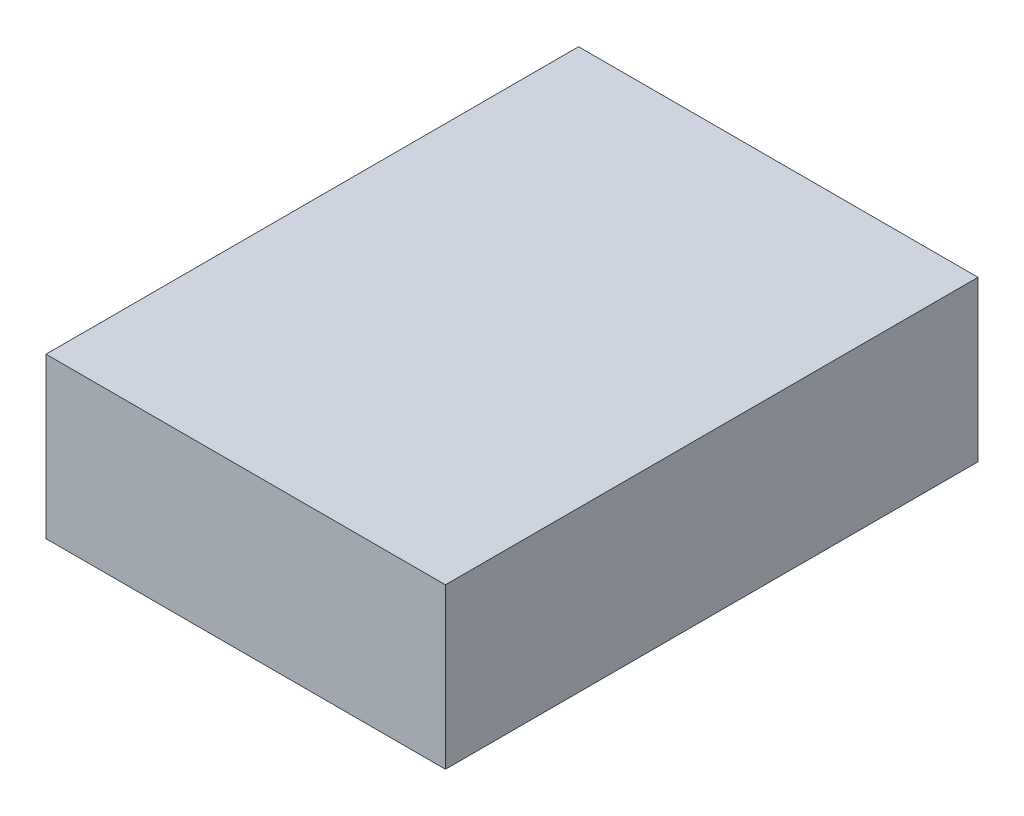
ISO-10303-21;
HEADER;
FILE_DESCRIPTION(('STEP AP214'),'2;1');
FILE_NAME('part.step','',(''),(''),'','','');
FILE_SCHEMA(('AUTOMOTIVE_DESIGN { 1 0 10303 214 1 1 1 1 }'));
ENDSEC;
DATA;
#1=APPLICATION_CONTEXT('core data for automotive mechanical design processes');
#2=APPLICATION_PROTOCOL_DEFINITION('international standard','automotive_design',2000,#1);
#3=PRODUCT_CONTEXT('',#1,'mechanical');
#4=PRODUCT('Part','Part','',(#3));
#5=PRODUCT_RELATED_PRODUCT_CATEGORY('part','',(#4));
#6=PRODUCT_DEFINITION_FORMATION('','',#4);
#7=PRODUCT_DEFINITION_CONTEXT('part definition',#1,'design');
#8=PRODUCT_DEFINITION('design','',#6,#7);
#9=PRODUCT_DEFINITION_SHAPE('','',#8);
#10=(LENGTH_UNIT() NAMED_UNIT(*) SI_UNIT(.MILLI.,.METRE.));
#11=(NAMED_UNIT(*) PLANE_ANGLE_UNIT() SI_UNIT($,.RADIAN.));
#12=(NAMED_UNIT(*) SI_UNIT($,.STERADIAN.) SOLID_ANGLE_UNIT());
#13=UNCERTAINTY_MEASURE_WITH_UNIT(LENGTH_MEASURE(1.E-05),#10,'distance_accuracy_value','');
#14=(GEOMETRIC_REPRESENTATION_CONTEXT(3) GLOBAL_UNCERTAINTY_ASSIGNED_CONTEXT((#13)) GLOBAL_UNIT_ASSIGNED_CONTEXT((#10,
#11,#12)) REPRESENTATION_CONTEXT('',''));
#15=CARTESIAN_POINT('',(0.,0.,0.));
#16=DIRECTION('',(0.,0.,1.));
#17=DIRECTION('',(1.,0.,0.));
#18=AXIS2_PLACEMENT_3D('',#15,#16,#17);
#19=CARTESIAN_POINT('',(0.,6.,0.));
#20=DIRECTION('',(1.,0.,0.));
#21=DIRECTION('',(0.,0.,-1.));
#22=AXIS2_PLACEMENT_3D('',#19,#20,#21);
#23=PLANE('',#22);
#24=DIRECTION('',(0.,0.,1.));
#25=VECTOR('',#24,1.);
#26=CARTESIAN_POINT('',(0.,0.,0.));
#27=LINE('',#26,#25);
#28=CARTESIAN_POINT('',(0.,0.,-20.));
#29=VERTEX_POINT('',#28);
#30=CARTESIAN_POINT('',(0.,0.,0.));
#31=VERTEX_POINT('',#30);
#32=EDGE_CURVE('E95',#29,#31,#27,.T.);
#33=ORIENTED_EDGE('',*,*,#32,.T.);
#34=DIRECTION('',(0.,-1.,0.));
#35=VECTOR('',#34,1.);
#36=CARTESIAN_POINT('',(0.,6.,0.));
#37=LINE('',#36,#35);
#38=CARTESIAN_POINT('',(0.,6.,0.));
#39=VERTEX_POINT('',#38);
#40=EDGE_CURVE('E11',#39,#31,#37,.T.);
#41=ORIENTED_EDGE('',*,*,#40,.F.);
#42=DIRECTION('',(0.,0.,1.));
#43=VECTOR('',#42,1.);
#44=CARTESIAN_POINT('',(0.,6.,0.));
#45=LINE('',#44,#43);
#46=CARTESIAN_POINT('',(0.,6.,-20.));
#47=VERTEX_POINT('',#46);
#48=EDGE_CURVE('E83',#47,#39,#45,.T.);
#49=ORIENTED_EDGE('',*,*,#48,.F.);
#50=DIRECTION('',(0.,-1.,0.));
#51=VECTOR('',#50,1.);
#52=CARTESIAN_POINT('',(0.,6.,-20.));
#53=LINE('',#52,#51);
#54=EDGE_CURVE('E91',#47,#29,#53,.T.);
#55=ORIENTED_EDGE('',*,*,#54,.T.);
#56=EDGE_LOOP('',(#33,#41,#49,#55));
#57=FACE_BOUND('',#56,.T.);
#58=ADVANCED_FACE('F32',(#57),#23,.F.);
#59=CARTESIAN_POINT('',(0.,6.,0.));
#60=DIRECTION('',(0.,0.,-1.));
#61=DIRECTION('',(-1.,0.,0.));
#62=AXIS2_PLACEMENT_3D('',#59,#60,#61);
#63=PLANE('',#62);
#64=DIRECTION('',(1.,0.,0.));
#65=VECTOR('',#64,1.);
#66=CARTESIAN_POINT('',(0.,0.,0.));
#67=LINE('',#66,#65);
#68=CARTESIAN_POINT('',(15.,0.,0.));
#69=VERTEX_POINT('',#68);
#70=EDGE_CURVE('E87',#31,#69,#67,.T.);
#71=ORIENTED_EDGE('',*,*,#70,.T.);
#72=DIRECTION('',(0.,-1.,0.));
#73=VECTOR('',#72,1.);
#74=CARTESIAN_POINT('',(15.,6.,0.));
#75=LINE('',#74,#73);
#76=CARTESIAN_POINT('',(15.,6.,0.));
#77=VERTEX_POINT('',#76);
#78=EDGE_CURVE('E40',#77,#69,#75,.T.);
#79=ORIENTED_EDGE('',*,*,#78,.F.);
#80=DIRECTION('',(1.,0.,0.));
#81=VECTOR('',#80,1.);
#82=CARTESIAN_POINT('',(0.,6.,0.));
#83=LINE('',#82,#81);
#84=EDGE_CURVE('E78',#39,#77,#83,.T.);
#85=ORIENTED_EDGE('',*,*,#84,.F.);
#86=ORIENTED_EDGE('',*,*,#40,.T.);
#87=EDGE_LOOP('',(#71,#79,#85,#86));
#88=FACE_BOUND('',#87,.T.);
#89=ADVANCED_FACE('F86',(#88),#63,.F.);
#90=CARTESIAN_POINT('',(15.,6.,0.));
#91=DIRECTION('',(-1.,0.,0.));
#92=DIRECTION('',(0.,0.,1.));
#93=AXIS2_PLACEMENT_3D('',#90,#91,#92);
#94=PLANE('',#93);
#95=DIRECTION('',(0.,0.,-1.));
#96=VECTOR('',#95,1.);
#97=CARTESIAN_POINT('',(15.,0.,0.));
#98=LINE('',#97,#96);
#99=CARTESIAN_POINT('',(15.,0.,-20.));
#100=VERTEX_POINT('',#99);
#101=EDGE_CURVE('E65',#69,#100,#98,.T.);
#102=ORIENTED_EDGE('',*,*,#101,.T.);
#103=DIRECTION('',(0.,-1.,0.));
#104=VECTOR('',#103,1.);
#105=CARTESIAN_POINT('',(15.,6.,-20.));
#106=LINE('',#105,#104);
#107=CARTESIAN_POINT('',(15.,6.,-20.));
#108=VERTEX_POINT('',#107);
#109=EDGE_CURVE('E88',#108,#100,#106,.T.);
#110=ORIENTED_EDGE('',*,*,#109,.F.);
#111=DIRECTION('',(0.,0.,-1.));
#112=VECTOR('',#111,1.);
#113=CARTESIAN_POINT('',(15.,6.,0.));
#114=LINE('',#113,#112);
#115=EDGE_CURVE('E81',#77,#108,#114,.T.);
#116=ORIENTED_EDGE('',*,*,#115,.F.);
#117=ORIENTED_EDGE('',*,*,#78,.T.);
#118=EDGE_LOOP('',(#102,#110,#116,#117));
#119=FACE_BOUND('',#118,.T.);
#120=ADVANCED_FACE('F89',(#119),#94,.F.);
#121=CARTESIAN_POINT('',(0.,6.,-20.));
#122=DIRECTION('',(0.,0.,1.));
#123=DIRECTION('',(1.,0.,0.));
#124=AXIS2_PLACEMENT_3D('',#121,#122,#123);
#125=PLANE('',#124);
#126=DIRECTION('',(-1.,0.,0.));
#127=VECTOR('',#126,1.);
#128=CARTESIAN_POINT('',(0.,0.,-20.));
#129=LINE('',#128,#127);
#130=EDGE_CURVE('E71',#100,#29,#129,.T.);
#131=ORIENTED_EDGE('',*,*,#130,.T.);
#132=ORIENTED_EDGE('',*,*,#54,.F.);
#133=DIRECTION('',(-1.,0.,0.));
#134=VECTOR('',#133,1.);
#135=CARTESIAN_POINT('',(0.,6.,-20.));
#136=LINE('',#135,#134);
#137=EDGE_CURVE('E48',#108,#47,#136,.T.);
#138=ORIENTED_EDGE('',*,*,#137,.F.);
#139=ORIENTED_EDGE('',*,*,#109,.T.);
#140=EDGE_LOOP('',(#131,#132,#138,#139));
#141=FACE_BOUND('',#140,.T.);
#142=ADVANCED_FACE('F102',(#141),#125,.F.);
#143=CARTESIAN_POINT('',(0.,6.,0.));
#144=DIRECTION('',(0.,-1.,0.));
#145=DIRECTION('',(0.,0.,-1.));
#146=AXIS2_PLACEMENT_3D('',#143,#144,#145);
#147=PLANE('',#146);
#148=ORIENTED_EDGE('',*,*,#48,.T.);
#149=ORIENTED_EDGE('',*,*,#84,.T.);
#150=ORIENTED_EDGE('',*,*,#115,.T.);
#151=ORIENTED_EDGE('',*,*,#137,.T.);
#152=EDGE_LOOP('',(#148,#149,#150,#151));
#153=FACE_BOUND('',#152,.T.);
#154=ADVANCED_FACE('F79',(#153),#147,.F.);
#155=CARTESIAN_POINT('',(0.,0.,0.));
#156=DIRECTION('',(0.,-1.,0.));
#157=DIRECTION('',(0.,0.,-1.));
#158=AXIS2_PLACEMENT_3D('',#155,#156,#157);
#159=PLANE('',#158);
#160=ORIENTED_EDGE('',*,*,#32,.F.);
#161=ORIENTED_EDGE('',*,*,#130,.F.);
#162=ORIENTED_EDGE('',*,*,#101,.F.);
#163=ORIENTED_EDGE('',*,*,#70,.F.);
#164=EDGE_LOOP('',(#160,#161,#162,#163));
#165=FACE_BOUND('',#164,.T.);
#166=ADVANCED_FACE('F105',(#165),#159,.T.);
#167=CLOSED_SHELL('',(#58,#89,#120,#142,#154,#166));
#168=MANIFOLD_SOLID_BREP('B2',#167);
#169=ADVANCED_BREP_SHAPE_REPRESENTATION('',(#18,#168),#14);
#170=SHAPE_DEFINITION_REPRESENTATION(#9,#169);
ENDSEC;
END-ISO-10303-21;
